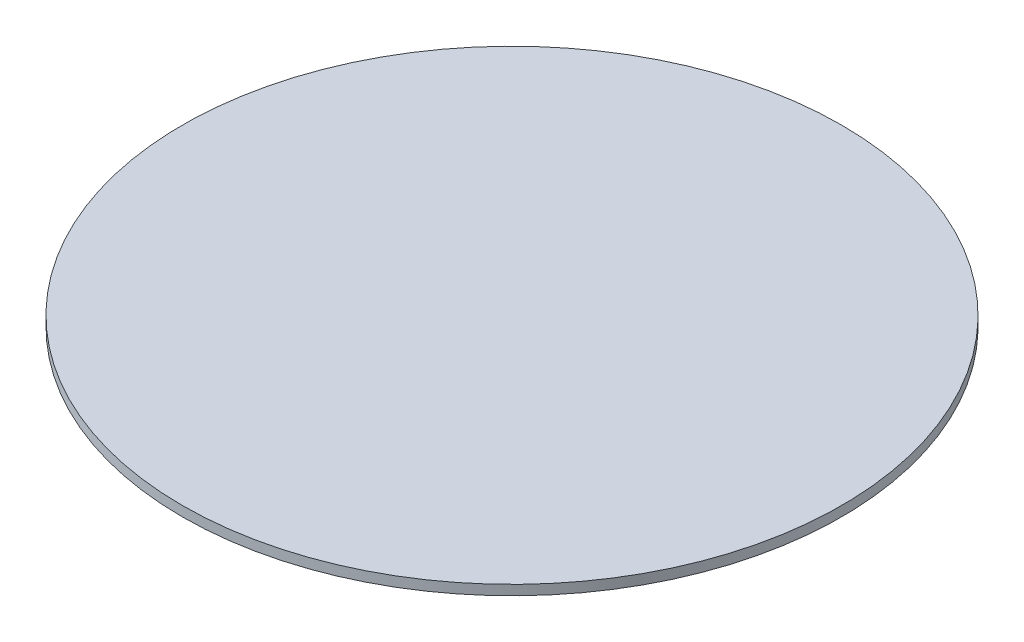
ISO-10303-21;
HEADER;
FILE_DESCRIPTION(('STEP AP214'),'2;1');
FILE_NAME('part.step','',(''),(''),'','','');
FILE_SCHEMA(('AUTOMOTIVE_DESIGN { 1 0 10303 214 1 1 1 1 }'));
ENDSEC;
DATA;
#1=APPLICATION_CONTEXT('core data for automotive mechanical design processes');
#2=APPLICATION_PROTOCOL_DEFINITION('international standard','automotive_design',2000,#1);
#3=PRODUCT_CONTEXT('',#1,'mechanical');
#4=PRODUCT('Part','Part','',(#3));
#5=PRODUCT_RELATED_PRODUCT_CATEGORY('part','',(#4));
#6=PRODUCT_DEFINITION_FORMATION('','',#4);
#7=PRODUCT_DEFINITION_CONTEXT('part definition',#1,'design');
#8=PRODUCT_DEFINITION('design','',#6,#7);
#9=PRODUCT_DEFINITION_SHAPE('','',#8);
#10=(LENGTH_UNIT() NAMED_UNIT(*) SI_UNIT(.MILLI.,.METRE.));
#11=(NAMED_UNIT(*) PLANE_ANGLE_UNIT() SI_UNIT($,.RADIAN.));
#12=(NAMED_UNIT(*) SI_UNIT($,.STERADIAN.) SOLID_ANGLE_UNIT());
#13=UNCERTAINTY_MEASURE_WITH_UNIT(LENGTH_MEASURE(1.E-05),#10,'distance_accuracy_value','');
#14=(GEOMETRIC_REPRESENTATION_CONTEXT(3) GLOBAL_UNCERTAINTY_ASSIGNED_CONTEXT((#13)) GLOBAL_UNIT_ASSIGNED_CONTEXT((#10,
#11,#12)) REPRESENTATION_CONTEXT('',''));
#15=CARTESIAN_POINT('',(0.,0.,0.));
#16=DIRECTION('',(0.,0.,1.));
#17=DIRECTION('',(1.,0.,0.));
#18=AXIS2_PLACEMENT_3D('',#15,#16,#17);
#19=CARTESIAN_POINT('',(0.,0.6,0.));
#20=DIRECTION('',(0.,-1.,0.));
#21=DIRECTION('',(0.,0.,-1.));
#22=AXIS2_PLACEMENT_3D('',#19,#20,#21);
#23=CYLINDRICAL_SURFACE('',#22,20.);
#24=CARTESIAN_POINT('',(0.,0.6,0.));
#25=DIRECTION('',(0.,1.,0.));
#26=DIRECTION('',(0.,0.,1.));
#27=AXIS2_PLACEMENT_3D('',#24,#25,#26);
#28=CIRCLE('',#27,20.);
#29=CARTESIAN_POINT('',(0.,0.6,20.));
#30=VERTEX_POINT('',#29);
#31=EDGE_CURVE('E10',#30,#30,#28,.T.);
#32=ORIENTED_EDGE('',*,*,#31,.F.);
#33=EDGE_LOOP('',(#32));
#34=FACE_BOUND('',#33,.T.);
#35=CARTESIAN_POINT('',(0.,0.,0.));
#36=DIRECTION('',(0.,1.,0.));
#37=DIRECTION('',(0.,0.,1.));
#38=AXIS2_PLACEMENT_3D('',#35,#36,#37);
#39=CIRCLE('',#38,20.);
#40=CARTESIAN_POINT('',(0.,0.,20.));
#41=VERTEX_POINT('',#40);
#42=EDGE_CURVE('E34',#41,#41,#39,.T.);
#43=ORIENTED_EDGE('',*,*,#42,.T.);
#44=EDGE_LOOP('',(#43));
#45=FACE_BOUND('',#44,.T.);
#46=ADVANCED_FACE('F31',(#34,#45),#23,.T.);
#47=CARTESIAN_POINT('',(0.,0.6,0.));
#48=DIRECTION('',(0.,1.,0.));
#49=DIRECTION('',(0.,0.,1.));
#50=AXIS2_PLACEMENT_3D('',#47,#48,#49);
#51=PLANE('',#50);
#52=ORIENTED_EDGE('',*,*,#31,.T.);
#53=EDGE_LOOP('',(#52));
#54=FACE_BOUND('',#53,.T.);
#55=ADVANCED_FACE('F46',(#54),#51,.T.);
#56=CARTESIAN_POINT('',(0.,0.,0.));
#57=DIRECTION('',(0.,1.,0.));
#58=DIRECTION('',(0.,0.,1.));
#59=AXIS2_PLACEMENT_3D('',#56,#57,#58);
#60=PLANE('',#59);
#61=ORIENTED_EDGE('',*,*,#42,.F.);
#62=EDGE_LOOP('',(#61));
#63=FACE_BOUND('',#62,.T.);
#64=ADVANCED_FACE('F44',(#63),#60,.F.);
#65=CLOSED_SHELL('',(#46,#55,#64));
#66=MANIFOLD_SOLID_BREP('B2',#65);
#67=ADVANCED_BREP_SHAPE_REPRESENTATION('',(#18,#66),#14);
#68=SHAPE_DEFINITION_REPRESENTATION(#9,#67);
ENDSEC;
END-ISO-10303-21;
